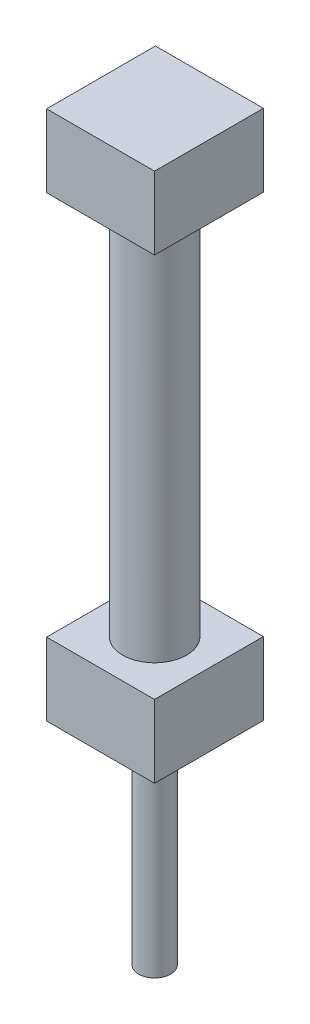
ISO-10303-21;
HEADER;
FILE_DESCRIPTION(('STEP AP214'),'2;1');
FILE_NAME('part.step','',(''),(''),'','','');
FILE_SCHEMA(('AUTOMOTIVE_DESIGN { 1 0 10303 214 1 1 1 1 }'));
ENDSEC;
DATA;
#1=APPLICATION_CONTEXT('core data for automotive mechanical design processes');
#2=APPLICATION_PROTOCOL_DEFINITION('international standard','automotive_design',2000,#1);
#3=PRODUCT_CONTEXT('',#1,'mechanical');
#4=PRODUCT('Part','Part','',(#3));
#5=PRODUCT_RELATED_PRODUCT_CATEGORY('part','',(#4));
#6=PRODUCT_DEFINITION_FORMATION('','',#4);
#7=PRODUCT_DEFINITION_CONTEXT('part definition',#1,'design');
#8=PRODUCT_DEFINITION('design','',#6,#7);
#9=PRODUCT_DEFINITION_SHAPE('','',#8);
#10=(LENGTH_UNIT() NAMED_UNIT(*) SI_UNIT(.MILLI.,.METRE.));
#11=(NAMED_UNIT(*) PLANE_ANGLE_UNIT() SI_UNIT($,.RADIAN.));
#12=(NAMED_UNIT(*) SI_UNIT($,.STERADIAN.) SOLID_ANGLE_UNIT());
#13=UNCERTAINTY_MEASURE_WITH_UNIT(LENGTH_MEASURE(1.E-05),#10,'distance_accuracy_value','');
#14=(GEOMETRIC_REPRESENTATION_CONTEXT(3) GLOBAL_UNCERTAINTY_ASSIGNED_CONTEXT((#13)) GLOBAL_UNIT_ASSIGNED_CONTEXT((#10,
#11,#12)) REPRESENTATION_CONTEXT('',''));
#15=CARTESIAN_POINT('',(0.,0.,0.));
#16=DIRECTION('',(0.,0.,1.));
#17=DIRECTION('',(1.,0.,0.));
#18=AXIS2_PLACEMENT_3D('',#15,#16,#17);
#19=CARTESIAN_POINT('',(0.,194.,0.));
#20=DIRECTION('',(0.,-1.,0.));
#21=DIRECTION('',(0.,0.,-1.));
#22=AXIS2_PLACEMENT_3D('',#19,#20,#21);
#23=CYLINDRICAL_SURFACE('',#22,15.);
#24=CARTESIAN_POINT('',(0.,180.,0.));
#25=DIRECTION('',(0.,-1.,0.));
#26=DIRECTION('',(0.,0.,-1.));
#27=AXIS2_PLACEMENT_3D('',#24,#25,#26);
#28=CIRCLE('',#27,15.);
#29=CARTESIAN_POINT('',(0.,180.,-15.));
#30=VERTEX_POINT('',#29);
#31=EDGE_CURVE('E131',#30,#30,#28,.T.);
#32=ORIENTED_EDGE('',*,*,#31,.T.);
#33=EDGE_LOOP('',(#32));
#34=FACE_BOUND('',#33,.T.);
#35=CARTESIAN_POINT('',(0.,0.,0.));
#36=DIRECTION('',(0.,1.,0.));
#37=DIRECTION('',(0.,0.,1.));
#38=AXIS2_PLACEMENT_3D('',#35,#36,#37);
#39=CIRCLE('',#38,15.);
#40=CARTESIAN_POINT('',(0.,0.,15.));
#41=VERTEX_POINT('',#40);
#42=EDGE_CURVE('E53',#41,#41,#39,.T.);
#43=ORIENTED_EDGE('',*,*,#42,.T.);
#44=EDGE_LOOP('',(#43));
#45=FACE_BOUND('',#44,.T.);
#46=ADVANCED_FACE('F45',(#34,#45),#23,.T.);
#47=CARTESIAN_POINT('',(-25.0619621250989,-34.0000000000001,-25.4576773165471));
#48=DIRECTION('',(1.,0.,0.));
#49=DIRECTION('',(0.,0.,-1.));
#50=AXIS2_PLACEMENT_3D('',#47,#48,#49);
#51=PLANE('',#50);
#52=DIRECTION('',(0.,0.,-1.));
#53=VECTOR('',#52,1.);
#54=CARTESIAN_POINT('',(-25.0619621250989,0.,-25.4576773165471));
#55=LINE('',#54,#53);
#56=CARTESIAN_POINT('',(-25.0619621250989,0.,25.4576773165485));
#57=VERTEX_POINT('',#56);
#58=CARTESIAN_POINT('',(-25.0619621250989,0.,-25.4576773165471));
#59=VERTEX_POINT('',#58);
#60=EDGE_CURVE('E172',#57,#59,#55,.T.);
#61=ORIENTED_EDGE('',*,*,#60,.T.);
#62=DIRECTION('',(0.,1.,0.));
#63=VECTOR('',#62,1.);
#64=CARTESIAN_POINT('',(-25.0619621250989,-34.0000000000001,-25.4576773165471));
#65=LINE('',#64,#63);
#66=CARTESIAN_POINT('',(-25.0619621250989,-34.0000000000001,-25.4576773165471));
#67=VERTEX_POINT('',#66);
#68=EDGE_CURVE('E184',#67,#59,#65,.T.);
#69=ORIENTED_EDGE('',*,*,#68,.F.);
#70=DIRECTION('',(0.,0.,-1.));
#71=VECTOR('',#70,1.);
#72=CARTESIAN_POINT('',(-25.0619621250989,-34.0000000000001,-25.4576773165471));
#73=LINE('',#72,#71);
#74=CARTESIAN_POINT('',(-25.0619621250989,-34.0000000000001,25.4576773165485));
#75=VERTEX_POINT('',#74);
#76=EDGE_CURVE('E165',#75,#67,#73,.T.);
#77=ORIENTED_EDGE('',*,*,#76,.F.);
#78=DIRECTION('',(0.,1.,0.));
#79=VECTOR('',#78,1.);
#80=CARTESIAN_POINT('',(-25.0619621250989,-34.0000000000001,25.4576773165485));
#81=LINE('',#80,#79);
#82=EDGE_CURVE('E171',#75,#57,#81,.T.);
#83=ORIENTED_EDGE('',*,*,#82,.T.);
#84=EDGE_LOOP('',(#61,#69,#77,#83));
#85=FACE_BOUND('',#84,.T.);
#86=ADVANCED_FACE('F212',(#85),#51,.F.);
#87=CARTESIAN_POINT('',(-25.0619621250989,-34.0000000000001,-25.4576773165471));
#88=DIRECTION('',(0.,0.,1.));
#89=DIRECTION('',(1.,0.,0.));
#90=AXIS2_PLACEMENT_3D('',#87,#88,#89);
#91=PLANE('',#90);
#92=DIRECTION('',(1.,0.,0.));
#93=VECTOR('',#92,1.);
#94=CARTESIAN_POINT('',(-25.0619621250989,0.,-25.4576773165471));
#95=LINE('',#94,#93);
#96=CARTESIAN_POINT('',(25.4137089619424,0.,-25.4576773165471));
#97=VERTEX_POINT('',#96);
#98=EDGE_CURVE('E175',#59,#97,#95,.T.);
#99=ORIENTED_EDGE('',*,*,#98,.T.);
#100=DIRECTION('',(0.,1.,0.));
#101=VECTOR('',#100,1.);
#102=CARTESIAN_POINT('',(25.4137089619424,-34.0000000000001,-25.4576773165471));
#103=LINE('',#102,#101);
#104=CARTESIAN_POINT('',(25.4137089619424,-34.0000000000001,-25.4576773165471));
#105=VERTEX_POINT('',#104);
#106=EDGE_CURVE('E182',#105,#97,#103,.T.);
#107=ORIENTED_EDGE('',*,*,#106,.F.);
#108=DIRECTION('',(1.,0.,0.));
#109=VECTOR('',#108,1.);
#110=CARTESIAN_POINT('',(-25.0619621250989,-34.0000000000001,-25.4576773165471));
#111=LINE('',#110,#109);
#112=EDGE_CURVE('E93',#67,#105,#111,.T.);
#113=ORIENTED_EDGE('',*,*,#112,.F.);
#114=ORIENTED_EDGE('',*,*,#68,.T.);
#115=EDGE_LOOP('',(#99,#107,#113,#114));
#116=FACE_BOUND('',#115,.T.);
#117=ADVANCED_FACE('F216',(#116),#91,.F.);
#118=CARTESIAN_POINT('',(25.4137089619424,-34.0000000000001,-25.4576773165471));
#119=DIRECTION('',(-1.,0.,0.));
#120=DIRECTION('',(0.,0.,1.));
#121=AXIS2_PLACEMENT_3D('',#118,#119,#120);
#122=PLANE('',#121);
#123=DIRECTION('',(0.,0.,1.));
#124=VECTOR('',#123,1.);
#125=CARTESIAN_POINT('',(25.4137089619424,0.,-25.4576773165471));
#126=LINE('',#125,#124);
#127=CARTESIAN_POINT('',(25.4137089619424,0.,25.4576773165485));
#128=VERTEX_POINT('',#127);
#129=EDGE_CURVE('E79',#97,#128,#126,.T.);
#130=ORIENTED_EDGE('',*,*,#129,.T.);
#131=DIRECTION('',(0.,1.,0.));
#132=VECTOR('',#131,1.);
#133=CARTESIAN_POINT('',(25.4137089619424,-34.0000000000001,25.4576773165485));
#134=LINE('',#133,#132);
#135=CARTESIAN_POINT('',(25.4137089619424,-34.0000000000001,25.4576773165485));
#136=VERTEX_POINT('',#135);
#137=EDGE_CURVE('E180',#136,#128,#134,.T.);
#138=ORIENTED_EDGE('',*,*,#137,.F.);
#139=DIRECTION('',(0.,0.,1.));
#140=VECTOR('',#139,1.);
#141=CARTESIAN_POINT('',(25.4137089619424,-34.0000000000001,-25.4576773165471));
#142=LINE('',#141,#140);
#143=EDGE_CURVE('E168',#105,#136,#142,.T.);
#144=ORIENTED_EDGE('',*,*,#143,.F.);
#145=ORIENTED_EDGE('',*,*,#106,.T.);
#146=EDGE_LOOP('',(#130,#138,#144,#145));
#147=FACE_BOUND('',#146,.T.);
#148=ADVANCED_FACE('F221',(#147),#122,.F.);
#149=CARTESIAN_POINT('',(-25.0619621250989,-34.0000000000001,25.4576773165485));
#150=DIRECTION('',(0.,0.,-1.));
#151=DIRECTION('',(-1.,0.,0.));
#152=AXIS2_PLACEMENT_3D('',#149,#150,#151);
#153=PLANE('',#152);
#154=DIRECTION('',(-1.,0.,0.));
#155=VECTOR('',#154,1.);
#156=CARTESIAN_POINT('',(-25.0619621250989,0.,25.4576773165485));
#157=LINE('',#156,#155);
#158=EDGE_CURVE('E85',#128,#57,#157,.T.);
#159=ORIENTED_EDGE('',*,*,#158,.T.);
#160=ORIENTED_EDGE('',*,*,#82,.F.);
#161=DIRECTION('',(-1.,0.,0.));
#162=VECTOR('',#161,1.);
#163=CARTESIAN_POINT('',(-25.0619621250989,-34.0000000000001,25.4576773165485));
#164=LINE('',#163,#162);
#165=EDGE_CURVE('E61',#136,#75,#164,.T.);
#166=ORIENTED_EDGE('',*,*,#165,.F.);
#167=ORIENTED_EDGE('',*,*,#137,.T.);
#168=EDGE_LOOP('',(#159,#160,#166,#167));
#169=FACE_BOUND('',#168,.T.);
#170=ADVANCED_FACE('F226',(#169),#153,.F.);
#171=CARTESIAN_POINT('',(0.,-34.0000000000001,0.));
#172=DIRECTION('',(0.,1.,0.));
#173=DIRECTION('',(0.,0.,1.));
#174=AXIS2_PLACEMENT_3D('',#171,#172,#173);
#175=PLANE('',#174);
#176=CARTESIAN_POINT('',(0.,-34.0000000000001,0.));
#177=DIRECTION('',(0.,1.,0.));
#178=DIRECTION('',(0.,0.,1.));
#179=AXIS2_PLACEMENT_3D('',#176,#177,#178);
#180=CIRCLE('',#179,7.5);
#181=CARTESIAN_POINT('',(0.,-34.0000000000001,7.5));
#182=VERTEX_POINT('',#181);
#183=EDGE_CURVE('E13',#182,#182,#180,.F.);
#184=ORIENTED_EDGE('',*,*,#183,.F.);
#185=EDGE_LOOP('',(#184));
#186=FACE_BOUND('',#185,.T.);
#187=ORIENTED_EDGE('',*,*,#76,.T.);
#188=ORIENTED_EDGE('',*,*,#112,.T.);
#189=ORIENTED_EDGE('',*,*,#143,.T.);
#190=ORIENTED_EDGE('',*,*,#165,.T.);
#191=EDGE_LOOP('',(#187,#188,#189,#190));
#192=FACE_BOUND('',#191,.T.);
#193=ADVANCED_FACE('F229',(#186,#192),#175,.F.);
#194=CARTESIAN_POINT('',(0.,0.,0.));
#195=DIRECTION('',(0.,1.,0.));
#196=DIRECTION('',(0.,0.,1.));
#197=AXIS2_PLACEMENT_3D('',#194,#195,#196);
#198=PLANE('',#197);
#199=ORIENTED_EDGE('',*,*,#42,.F.);
#200=EDGE_LOOP('',(#199));
#201=FACE_BOUND('',#200,.T.);
#202=ORIENTED_EDGE('',*,*,#60,.F.);
#203=ORIENTED_EDGE('',*,*,#158,.F.);
#204=ORIENTED_EDGE('',*,*,#129,.F.);
#205=ORIENTED_EDGE('',*,*,#98,.F.);
#206=EDGE_LOOP('',(#202,#203,#204,#205));
#207=FACE_BOUND('',#206,.T.);
#208=ADVANCED_FACE('F230',(#201,#207),#198,.T.);
#209=CARTESIAN_POINT('',(-25.0619621250989,214.,-25.4576773165471));
#210=DIRECTION('',(-1.,0.,0.));
#211=DIRECTION('',(0.,0.,1.));
#212=AXIS2_PLACEMENT_3D('',#209,#210,#211);
#213=PLANE('',#212);
#214=DIRECTION('',(0.,0.,-1.));
#215=VECTOR('',#214,1.);
#216=CARTESIAN_POINT('',(-25.0619621250989,180.,-25.4576773165471));
#217=LINE('',#216,#215);
#218=CARTESIAN_POINT('',(-25.0619621250989,180.,25.4576773165485));
#219=VERTEX_POINT('',#218);
#220=CARTESIAN_POINT('',(-25.0619621250989,180.,-25.4576773165471));
#221=VERTEX_POINT('',#220);
#222=EDGE_CURVE('E126',#219,#221,#217,.T.);
#223=ORIENTED_EDGE('',*,*,#222,.F.);
#224=DIRECTION('',(0.,-1.,0.));
#225=VECTOR('',#224,1.);
#226=CARTESIAN_POINT('',(-25.0619621250989,214.,25.4576773165485));
#227=LINE('',#226,#225);
#228=CARTESIAN_POINT('',(-25.0619621250989,214.,25.4576773165485));
#229=VERTEX_POINT('',#228);
#230=EDGE_CURVE('E120',#229,#219,#227,.T.);
#231=ORIENTED_EDGE('',*,*,#230,.F.);
#232=DIRECTION('',(0.,0.,-1.));
#233=VECTOR('',#232,1.);
#234=CARTESIAN_POINT('',(-25.0619621250989,214.,-25.4576773165471));
#235=LINE('',#234,#233);
#236=CARTESIAN_POINT('',(-25.0619621250989,214.,-25.4576773165471));
#237=VERTEX_POINT('',#236);
#238=EDGE_CURVE('E123',#229,#237,#235,.T.);
#239=ORIENTED_EDGE('',*,*,#238,.T.);
#240=DIRECTION('',(0.,-1.,0.));
#241=VECTOR('',#240,1.);
#242=CARTESIAN_POINT('',(-25.0619621250989,214.,-25.4576773165471));
#243=LINE('',#242,#241);
#244=EDGE_CURVE('E151',#237,#221,#243,.T.);
#245=ORIENTED_EDGE('',*,*,#244,.T.);
#246=EDGE_LOOP('',(#223,#231,#239,#245));
#247=FACE_BOUND('',#246,.T.);
#248=ADVANCED_FACE('F122',(#247),#213,.T.);
#249=CARTESIAN_POINT('',(-25.0619621250989,214.,25.4576773165485));
#250=DIRECTION('',(0.,0.,1.));
#251=DIRECTION('',(1.,0.,0.));
#252=AXIS2_PLACEMENT_3D('',#249,#250,#251);
#253=PLANE('',#252);
#254=DIRECTION('',(-1.,0.,0.));
#255=VECTOR('',#254,1.);
#256=CARTESIAN_POINT('',(-25.0619621250989,180.,25.4576773165485));
#257=LINE('',#256,#255);
#258=CARTESIAN_POINT('',(25.4137089619424,180.,25.4576773165485));
#259=VERTEX_POINT('',#258);
#260=EDGE_CURVE('E153',#259,#219,#257,.T.);
#261=ORIENTED_EDGE('',*,*,#260,.F.);
#262=DIRECTION('',(0.,-1.,0.));
#263=VECTOR('',#262,1.);
#264=CARTESIAN_POINT('',(25.4137089619424,214.,25.4576773165485));
#265=LINE('',#264,#263);
#266=CARTESIAN_POINT('',(25.4137089619424,214.,25.4576773165485));
#267=VERTEX_POINT('',#266);
#268=EDGE_CURVE('E132',#267,#259,#265,.T.);
#269=ORIENTED_EDGE('',*,*,#268,.F.);
#270=DIRECTION('',(-1.,0.,0.));
#271=VECTOR('',#270,1.);
#272=CARTESIAN_POINT('',(-25.0619621250989,214.,25.4576773165485));
#273=LINE('',#272,#271);
#274=EDGE_CURVE('E138',#267,#229,#273,.T.);
#275=ORIENTED_EDGE('',*,*,#274,.T.);
#276=ORIENTED_EDGE('',*,*,#230,.T.);
#277=EDGE_LOOP('',(#261,#269,#275,#276));
#278=FACE_BOUND('',#277,.T.);
#279=ADVANCED_FACE('F144',(#278),#253,.T.);
#280=CARTESIAN_POINT('',(25.4137089619424,214.,-25.4576773165471));
#281=DIRECTION('',(1.,0.,0.));
#282=DIRECTION('',(0.,0.,-1.));
#283=AXIS2_PLACEMENT_3D('',#280,#281,#282);
#284=PLANE('',#283);
#285=DIRECTION('',(0.,0.,1.));
#286=VECTOR('',#285,1.);
#287=CARTESIAN_POINT('',(25.4137089619424,180.,-25.4576773165471));
#288=LINE('',#287,#286);
#289=CARTESIAN_POINT('',(25.4137089619424,180.,-25.4576773165471));
#290=VERTEX_POINT('',#289);
#291=EDGE_CURVE('E156',#290,#259,#288,.T.);
#292=ORIENTED_EDGE('',*,*,#291,.F.);
#293=DIRECTION('',(0.,-1.,0.));
#294=VECTOR('',#293,1.);
#295=CARTESIAN_POINT('',(25.4137089619424,214.,-25.4576773165471));
#296=LINE('',#295,#294);
#297=CARTESIAN_POINT('',(25.4137089619424,214.,-25.4576773165471));
#298=VERTEX_POINT('',#297);
#299=EDGE_CURVE('E162',#298,#290,#296,.T.);
#300=ORIENTED_EDGE('',*,*,#299,.F.);
#301=DIRECTION('',(0.,0.,1.));
#302=VECTOR('',#301,1.);
#303=CARTESIAN_POINT('',(25.4137089619424,214.,-25.4576773165471));
#304=LINE('',#303,#302);
#305=EDGE_CURVE('E145',#298,#267,#304,.T.);
#306=ORIENTED_EDGE('',*,*,#305,.T.);
#307=ORIENTED_EDGE('',*,*,#268,.T.);
#308=EDGE_LOOP('',(#292,#300,#306,#307));
#309=FACE_BOUND('',#308,.T.);
#310=ADVANCED_FACE('F202',(#309),#284,.T.);
#311=CARTESIAN_POINT('',(-25.0619621250989,214.,-25.4576773165471));
#312=DIRECTION('',(0.,0.,-1.));
#313=DIRECTION('',(-1.,0.,0.));
#314=AXIS2_PLACEMENT_3D('',#311,#312,#313);
#315=PLANE('',#314);
#316=DIRECTION('',(1.,0.,0.));
#317=VECTOR('',#316,1.);
#318=CARTESIAN_POINT('',(-25.0619621250989,180.,-25.4576773165471));
#319=LINE('',#318,#317);
#320=EDGE_CURVE('E142',#221,#290,#319,.T.);
#321=ORIENTED_EDGE('',*,*,#320,.F.);
#322=ORIENTED_EDGE('',*,*,#244,.F.);
#323=DIRECTION('',(1.,0.,0.));
#324=VECTOR('',#323,1.);
#325=CARTESIAN_POINT('',(-25.0619621250989,214.,-25.4576773165471));
#326=LINE('',#325,#324);
#327=EDGE_CURVE('E141',#237,#298,#326,.T.);
#328=ORIENTED_EDGE('',*,*,#327,.T.);
#329=ORIENTED_EDGE('',*,*,#299,.T.);
#330=EDGE_LOOP('',(#321,#322,#328,#329));
#331=FACE_BOUND('',#330,.T.);
#332=ADVANCED_FACE('F199',(#331),#315,.T.);
#333=CARTESIAN_POINT('',(0.,214.,0.));
#334=DIRECTION('',(0.,-1.,0.));
#335=DIRECTION('',(0.,0.,1.));
#336=AXIS2_PLACEMENT_3D('',#333,#334,#335);
#337=PLANE('',#336);
#338=ORIENTED_EDGE('',*,*,#238,.F.);
#339=ORIENTED_EDGE('',*,*,#274,.F.);
#340=ORIENTED_EDGE('',*,*,#305,.F.);
#341=ORIENTED_EDGE('',*,*,#327,.F.);
#342=EDGE_LOOP('',(#338,#339,#340,#341));
#343=FACE_BOUND('',#342,.T.);
#344=ADVANCED_FACE('F136',(#343),#337,.F.);
#345=CARTESIAN_POINT('',(0.,180.,0.));
#346=DIRECTION('',(0.,-1.,0.));
#347=DIRECTION('',(0.,0.,1.));
#348=AXIS2_PLACEMENT_3D('',#345,#346,#347);
#349=PLANE('',#348);
#350=ORIENTED_EDGE('',*,*,#31,.F.);
#351=EDGE_LOOP('',(#350));
#352=FACE_BOUND('',#351,.T.);
#353=ORIENTED_EDGE('',*,*,#222,.T.);
#354=ORIENTED_EDGE('',*,*,#320,.T.);
#355=ORIENTED_EDGE('',*,*,#291,.T.);
#356=ORIENTED_EDGE('',*,*,#260,.T.);
#357=EDGE_LOOP('',(#353,#354,#355,#356));
#358=FACE_BOUND('',#357,.T.);
#359=ADVANCED_FACE('F192',(#352,#358),#349,.T.);
#360=CARTESIAN_POINT('',(0.,-133.,0.));
#361=DIRECTION('',(0.,1.,0.));
#362=DIRECTION('',(0.,0.,1.));
#363=AXIS2_PLACEMENT_3D('',#360,#361,#362);
#364=CYLINDRICAL_SURFACE('',#363,7.5);
#365=CARTESIAN_POINT('',(0.,-133.,0.));
#366=DIRECTION('',(0.,-1.,0.));
#367=DIRECTION('',(0.,0.,-1.));
#368=AXIS2_PLACEMENT_3D('',#365,#366,#367);
#369=CIRCLE('',#368,7.5);
#370=CARTESIAN_POINT('',(0.,-133.,-7.5));
#371=VERTEX_POINT('',#370);
#372=EDGE_CURVE('E154',#371,#371,#369,.T.);
#373=ORIENTED_EDGE('',*,*,#372,.F.);
#374=EDGE_LOOP('',(#373));
#375=FACE_BOUND('',#374,.T.);
#376=ORIENTED_EDGE('',*,*,#183,.T.);
#377=EDGE_LOOP('',(#376));
#378=FACE_BOUND('',#377,.T.);
#379=ADVANCED_FACE('F195',(#375,#378),#364,.T.);
#380=CARTESIAN_POINT('',(0.,-133.,0.));
#381=DIRECTION('',(0.,-1.,0.));
#382=DIRECTION('',(0.,0.,-1.));
#383=AXIS2_PLACEMENT_3D('',#380,#381,#382);
#384=PLANE('',#383);
#385=ORIENTED_EDGE('',*,*,#372,.T.);
#386=EDGE_LOOP('',(#385));
#387=FACE_BOUND('',#386,.T.);
#388=ADVANCED_FACE('F287',(#387),#384,.T.);
#389=CLOSED_SHELL('',(#46,#86,#117,#148,#170,#193,#208,#248,#279,#310,#332,#344,#359,#379,#388));
#390=MANIFOLD_SOLID_BREP('B2',#389);
#391=ADVANCED_BREP_SHAPE_REPRESENTATION('',(#18,#390),#14);
#392=SHAPE_DEFINITION_REPRESENTATION(#9,#391);
ENDSEC;
END-ISO-10303-21;
